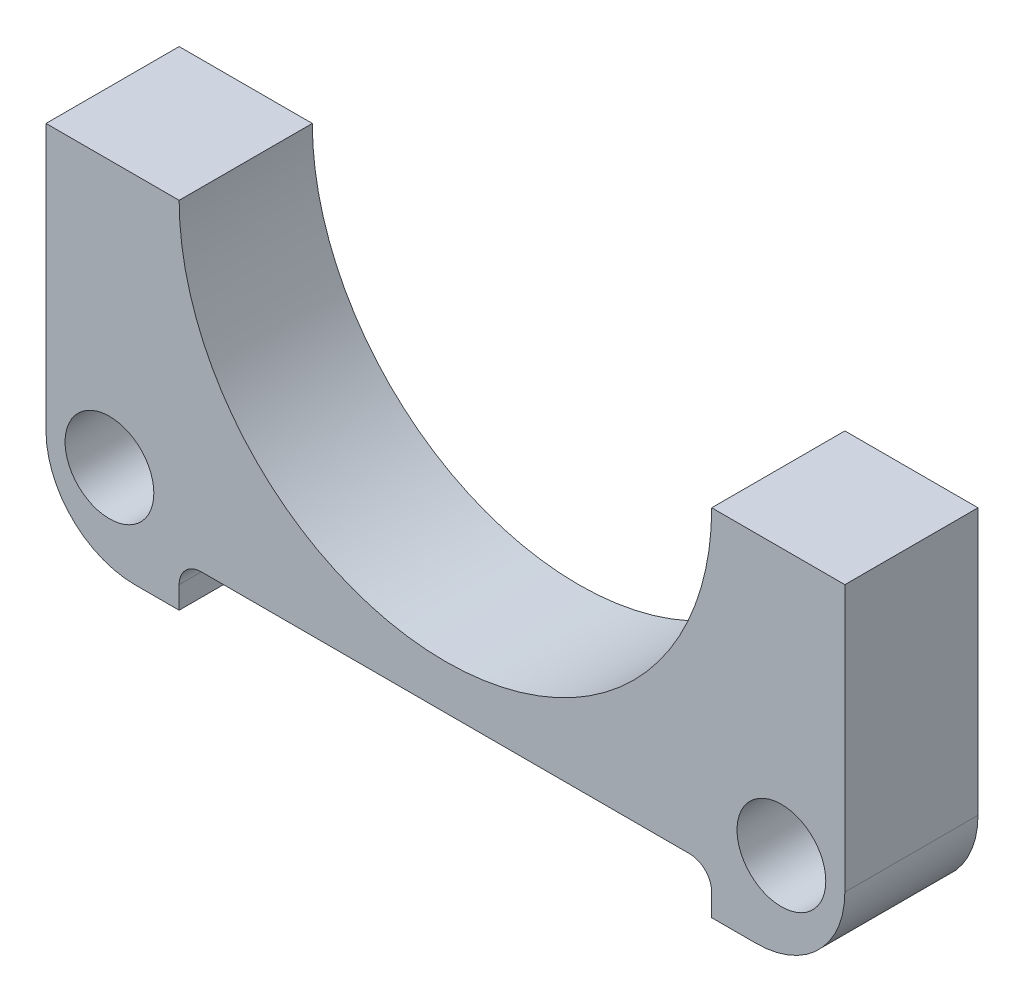
ISO-10303-21;
HEADER;
FILE_DESCRIPTION(('STEP AP214'),'2;1');
FILE_NAME('part.step','',(''),(''),'','','');
FILE_SCHEMA(('AUTOMOTIVE_DESIGN { 1 0 10303 214 1 1 1 1 }'));
ENDSEC;
DATA;
#1=APPLICATION_CONTEXT('core data for automotive mechanical design processes');
#2=APPLICATION_PROTOCOL_DEFINITION('international standard','automotive_design',2000,#1);
#3=PRODUCT_CONTEXT('',#1,'mechanical');
#4=PRODUCT('Part','Part','',(#3));
#5=PRODUCT_RELATED_PRODUCT_CATEGORY('part','',(#4));
#6=PRODUCT_DEFINITION_FORMATION('','',#4);
#7=PRODUCT_DEFINITION_CONTEXT('part definition',#1,'design');
#8=PRODUCT_DEFINITION('design','',#6,#7);
#9=PRODUCT_DEFINITION_SHAPE('','',#8);
#10=(LENGTH_UNIT() NAMED_UNIT(*) SI_UNIT(.MILLI.,.METRE.));
#11=(NAMED_UNIT(*) PLANE_ANGLE_UNIT() SI_UNIT($,.RADIAN.));
#12=(NAMED_UNIT(*) SI_UNIT($,.STERADIAN.) SOLID_ANGLE_UNIT());
#13=UNCERTAINTY_MEASURE_WITH_UNIT(LENGTH_MEASURE(1.E-05),#10,'distance_accuracy_value','');
#14=(GEOMETRIC_REPRESENTATION_CONTEXT(3) GLOBAL_UNCERTAINTY_ASSIGNED_CONTEXT((#13)) GLOBAL_UNIT_ASSIGNED_CONTEXT((#10,
#11,#12)) REPRESENTATION_CONTEXT('',''));
#15=CARTESIAN_POINT('',(0.,0.,0.));
#16=DIRECTION('',(0.,0.,1.));
#17=DIRECTION('',(1.,0.,0.));
#18=AXIS2_PLACEMENT_3D('',#15,#16,#17);
#19=CARTESIAN_POINT('',(-70.,-20.,15.));
#20=DIRECTION('',(0.,0.,1.));
#21=DIRECTION('',(1.,0.,0.));
#22=AXIS2_PLACEMENT_3D('',#19,#20,#21);
#23=PLANE('',#22);
#24=CARTESIAN_POINT('',(-75.7021101109994,-20.,15.));
#25=DIRECTION('',(0.,0.,1.));
#26=DIRECTION('',(1.,0.,0.));
#27=AXIS2_PLACEMENT_3D('',#24,#25,#26);
#28=CIRCLE('',#27,9.99999999999999);
#29=CARTESIAN_POINT('',(-65.7021101109994,-20.,15.));
#30=VERTEX_POINT('',#29);
#31=EDGE_CURVE('E188',#30,#30,#28,.T.);
#32=ORIENTED_EDGE('',*,*,#31,.F.);
#33=EDGE_LOOP('',(#32));
#34=FACE_BOUND('',#33,.T.);
#35=DIRECTION('',(0.,-1.,0.));
#36=VECTOR('',#35,1.);
#37=CARTESIAN_POINT('',(-90.,40.,15.));
#38=LINE('',#37,#36);
#39=CARTESIAN_POINT('',(-90.,40.,15.));
#40=VERTEX_POINT('',#39);
#41=CARTESIAN_POINT('',(-90.,-19.9999999999998,15.));
#42=VERTEX_POINT('',#41);
#43=EDGE_CURVE('E224',#40,#42,#38,.T.);
#44=ORIENTED_EDGE('',*,*,#43,.T.);
#45=CARTESIAN_POINT('',(-70.,-20.,15.));
#46=DIRECTION('',(0.,0.,1.));
#47=DIRECTION('',(1.,0.,0.));
#48=AXIS2_PLACEMENT_3D('',#45,#46,#47);
#49=CIRCLE('',#48,20.);
#50=CARTESIAN_POINT('',(-69.9999999999999,-40.,15.));
#51=VERTEX_POINT('',#50);
#52=EDGE_CURVE('E124',#42,#51,#49,.T.);
#53=ORIENTED_EDGE('',*,*,#52,.T.);
#54=DIRECTION('',(1.,0.,0.));
#55=VECTOR('',#54,1.);
#56=CARTESIAN_POINT('',(-69.9999999999999,-40.,15.));
#57=LINE('',#56,#55);
#58=CARTESIAN_POINT('',(-60.,-40.,15.));
#59=VERTEX_POINT('',#58);
#60=EDGE_CURVE('E269',#51,#59,#57,.T.);
#61=ORIENTED_EDGE('',*,*,#60,.T.);
#62=DIRECTION('',(0.,1.,0.));
#63=VECTOR('',#62,1.);
#64=CARTESIAN_POINT('',(-60.,-35.,15.));
#65=LINE('',#64,#63);
#66=CARTESIAN_POINT('',(-60.,-35.,15.));
#67=VERTEX_POINT('',#66);
#68=EDGE_CURVE('E289',#59,#67,#65,.T.);
#69=ORIENTED_EDGE('',*,*,#68,.T.);
#70=CARTESIAN_POINT('',(-55.,-35.,15.));
#71=DIRECTION('',(0.,0.,-1.));
#72=DIRECTION('',(1.,0.,0.));
#73=AXIS2_PLACEMENT_3D('',#70,#71,#72);
#74=CIRCLE('',#73,5.);
#75=CARTESIAN_POINT('',(-55.,-30.,15.));
#76=VERTEX_POINT('',#75);
#77=EDGE_CURVE('E285',#67,#76,#74,.T.);
#78=ORIENTED_EDGE('',*,*,#77,.T.);
#79=DIRECTION('',(1.,0.,0.));
#80=VECTOR('',#79,1.);
#81=CARTESIAN_POINT('',(-55.,-30.,15.));
#82=LINE('',#81,#80);
#83=CARTESIAN_POINT('',(55.,-30.,15.));
#84=VERTEX_POINT('',#83);
#85=EDGE_CURVE('E288',#76,#84,#82,.T.);
#86=ORIENTED_EDGE('',*,*,#85,.T.);
#87=CARTESIAN_POINT('',(55.,-35.,15.));
#88=DIRECTION('',(0.,0.,-1.));
#89=DIRECTION('',(-1.,0.,0.));
#90=AXIS2_PLACEMENT_3D('',#87,#88,#89);
#91=CIRCLE('',#90,5.);
#92=CARTESIAN_POINT('',(60.,-35.,15.));
#93=VERTEX_POINT('',#92);
#94=EDGE_CURVE('E293',#84,#93,#91,.T.);
#95=ORIENTED_EDGE('',*,*,#94,.T.);
#96=DIRECTION('',(0.,-1.,0.));
#97=VECTOR('',#96,1.);
#98=CARTESIAN_POINT('',(60.,-35.,15.));
#99=LINE('',#98,#97);
#100=CARTESIAN_POINT('',(60.,-40.,15.));
#101=VERTEX_POINT('',#100);
#102=EDGE_CURVE('E300',#93,#101,#99,.T.);
#103=ORIENTED_EDGE('',*,*,#102,.T.);
#104=DIRECTION('',(1.,0.,0.));
#105=VECTOR('',#104,1.);
#106=CARTESIAN_POINT('',(60.,-40.,15.));
#107=LINE('',#106,#105);
#108=CARTESIAN_POINT('',(69.9999999999998,-40.,15.));
#109=VERTEX_POINT('',#108);
#110=EDGE_CURVE('E303',#101,#109,#107,.T.);
#111=ORIENTED_EDGE('',*,*,#110,.T.);
#112=CARTESIAN_POINT('',(70.,-20.,15.));
#113=DIRECTION('',(0.,0.,1.));
#114=DIRECTION('',(1.,0.,0.));
#115=AXIS2_PLACEMENT_3D('',#112,#113,#114);
#116=CIRCLE('',#115,20.);
#117=CARTESIAN_POINT('',(90.,-19.9999999999999,15.));
#118=VERTEX_POINT('',#117);
#119=EDGE_CURVE('E306',#109,#118,#116,.T.);
#120=ORIENTED_EDGE('',*,*,#119,.T.);
#121=DIRECTION('',(0.,1.,0.));
#122=VECTOR('',#121,1.);
#123=CARTESIAN_POINT('',(90.,40.,15.));
#124=LINE('',#123,#122);
#125=CARTESIAN_POINT('',(90.,40.,15.));
#126=VERTEX_POINT('',#125);
#127=EDGE_CURVE('E161',#118,#126,#124,.T.);
#128=ORIENTED_EDGE('',*,*,#127,.T.);
#129=DIRECTION('',(-1.,0.,0.));
#130=VECTOR('',#129,1.);
#131=CARTESIAN_POINT('',(60.,40.,15.));
#132=LINE('',#131,#130);
#133=CARTESIAN_POINT('',(60.,40.,15.));
#134=VERTEX_POINT('',#133);
#135=EDGE_CURVE('E155',#126,#134,#132,.T.);
#136=ORIENTED_EDGE('',*,*,#135,.T.);
#137=CARTESIAN_POINT('',(0.,40.,15.));
#138=DIRECTION('',(0.,0.,-1.));
#139=DIRECTION('',(1.,0.,0.));
#140=AXIS2_PLACEMENT_3D('',#137,#138,#139);
#141=CIRCLE('',#140,60.);
#142=CARTESIAN_POINT('',(-60.,40.,15.));
#143=VERTEX_POINT('',#142);
#144=EDGE_CURVE('E159',#134,#143,#141,.T.);
#145=ORIENTED_EDGE('',*,*,#144,.T.);
#146=DIRECTION('',(-1.,0.,0.));
#147=VECTOR('',#146,1.);
#148=CARTESIAN_POINT('',(-90.,40.,15.));
#149=LINE('',#148,#147);
#150=EDGE_CURVE('E63',#143,#40,#149,.T.);
#151=ORIENTED_EDGE('',*,*,#150,.T.);
#152=EDGE_LOOP('',(#44,#53,#61,#69,#78,#86,#95,#103,#111,#120,#128,#136,#145,#151));
#153=FACE_BOUND('',#152,.T.);
#154=CARTESIAN_POINT('',(75.7,-20.,15.));
#155=DIRECTION('',(0.,0.,1.));
#156=DIRECTION('',(1.,0.,0.));
#157=AXIS2_PLACEMENT_3D('',#154,#155,#156);
#158=CIRCLE('',#157,9.99999999999999);
#159=CARTESIAN_POINT('',(85.7,-20.,15.));
#160=VERTEX_POINT('',#159);
#161=EDGE_CURVE('E350',#160,#160,#158,.T.);
#162=ORIENTED_EDGE('',*,*,#161,.F.);
#163=EDGE_LOOP('',(#162));
#164=FACE_BOUND('',#163,.T.);
#165=ADVANCED_FACE('F45',(#34,#153,#164),#23,.T.);
#166=CARTESIAN_POINT('',(-70.,-20.,-15.));
#167=DIRECTION('',(0.,0.,1.));
#168=DIRECTION('',(1.,0.,0.));
#169=AXIS2_PLACEMENT_3D('',#166,#167,#168);
#170=PLANE('',#169);
#171=DIRECTION('',(0.,-1.,0.));
#172=VECTOR('',#171,1.);
#173=CARTESIAN_POINT('',(-90.,40.,-15.));
#174=LINE('',#173,#172);
#175=CARTESIAN_POINT('',(-90.,40.,-15.));
#176=VERTEX_POINT('',#175);
#177=CARTESIAN_POINT('',(-90.,-19.9999999999998,-15.));
#178=VERTEX_POINT('',#177);
#179=EDGE_CURVE('E183',#176,#178,#174,.T.);
#180=ORIENTED_EDGE('',*,*,#179,.F.);
#181=DIRECTION('',(-1.,0.,0.));
#182=VECTOR('',#181,1.);
#183=CARTESIAN_POINT('',(-90.,40.,-15.));
#184=LINE('',#183,#182);
#185=CARTESIAN_POINT('',(-60.,40.,-15.));
#186=VERTEX_POINT('',#185);
#187=EDGE_CURVE('E116',#186,#176,#184,.T.);
#188=ORIENTED_EDGE('',*,*,#187,.F.);
#189=CARTESIAN_POINT('',(0.,40.,-15.));
#190=DIRECTION('',(0.,0.,-1.));
#191=DIRECTION('',(1.,0.,0.));
#192=AXIS2_PLACEMENT_3D('',#189,#190,#191);
#193=CIRCLE('',#192,60.);
#194=CARTESIAN_POINT('',(60.,40.,-15.));
#195=VERTEX_POINT('',#194);
#196=EDGE_CURVE('E110',#195,#186,#193,.T.);
#197=ORIENTED_EDGE('',*,*,#196,.F.);
#198=DIRECTION('',(-1.,0.,0.));
#199=VECTOR('',#198,1.);
#200=CARTESIAN_POINT('',(60.,40.,-15.));
#201=LINE('',#200,#199);
#202=CARTESIAN_POINT('',(90.,40.,-15.));
#203=VERTEX_POINT('',#202);
#204=EDGE_CURVE('E170',#203,#195,#201,.T.);
#205=ORIENTED_EDGE('',*,*,#204,.F.);
#206=DIRECTION('',(0.,1.,0.));
#207=VECTOR('',#206,1.);
#208=CARTESIAN_POINT('',(90.,40.,-15.));
#209=LINE('',#208,#207);
#210=CARTESIAN_POINT('',(90.,-19.9999999999999,-15.));
#211=VERTEX_POINT('',#210);
#212=EDGE_CURVE('E215',#211,#203,#209,.T.);
#213=ORIENTED_EDGE('',*,*,#212,.F.);
#214=CARTESIAN_POINT('',(70.,-20.,-15.));
#215=DIRECTION('',(0.,0.,1.));
#216=DIRECTION('',(1.,0.,0.));
#217=AXIS2_PLACEMENT_3D('',#214,#215,#216);
#218=CIRCLE('',#217,20.);
#219=CARTESIAN_POINT('',(69.9999999999998,-40.,-15.));
#220=VERTEX_POINT('',#219);
#221=EDGE_CURVE('E212',#220,#211,#218,.T.);
#222=ORIENTED_EDGE('',*,*,#221,.F.);
#223=DIRECTION('',(1.,0.,0.));
#224=VECTOR('',#223,1.);
#225=CARTESIAN_POINT('',(60.,-40.,-15.));
#226=LINE('',#225,#224);
#227=CARTESIAN_POINT('',(60.,-40.,-15.));
#228=VERTEX_POINT('',#227);
#229=EDGE_CURVE('E209',#228,#220,#226,.T.);
#230=ORIENTED_EDGE('',*,*,#229,.F.);
#231=DIRECTION('',(0.,-1.,0.));
#232=VECTOR('',#231,1.);
#233=CARTESIAN_POINT('',(60.,-35.,-15.));
#234=LINE('',#233,#232);
#235=CARTESIAN_POINT('',(60.,-35.,-15.));
#236=VERTEX_POINT('',#235);
#237=EDGE_CURVE('E206',#236,#228,#234,.T.);
#238=ORIENTED_EDGE('',*,*,#237,.F.);
#239=CARTESIAN_POINT('',(55.,-35.,-15.));
#240=DIRECTION('',(0.,0.,-1.));
#241=DIRECTION('',(-1.,0.,0.));
#242=AXIS2_PLACEMENT_3D('',#239,#240,#241);
#243=CIRCLE('',#242,5.);
#244=CARTESIAN_POINT('',(55.,-30.,-15.));
#245=VERTEX_POINT('',#244);
#246=EDGE_CURVE('E203',#245,#236,#243,.T.);
#247=ORIENTED_EDGE('',*,*,#246,.F.);
#248=DIRECTION('',(1.,0.,0.));
#249=VECTOR('',#248,1.);
#250=CARTESIAN_POINT('',(-55.,-30.,-15.));
#251=LINE('',#250,#249);
#252=CARTESIAN_POINT('',(-55.,-30.,-15.));
#253=VERTEX_POINT('',#252);
#254=EDGE_CURVE('E200',#253,#245,#251,.T.);
#255=ORIENTED_EDGE('',*,*,#254,.F.);
#256=CARTESIAN_POINT('',(-55.,-35.,-15.));
#257=DIRECTION('',(0.,0.,-1.));
#258=DIRECTION('',(1.,0.,0.));
#259=AXIS2_PLACEMENT_3D('',#256,#257,#258);
#260=CIRCLE('',#259,5.);
#261=CARTESIAN_POINT('',(-60.,-35.,-15.));
#262=VERTEX_POINT('',#261);
#263=EDGE_CURVE('E197',#262,#253,#260,.T.);
#264=ORIENTED_EDGE('',*,*,#263,.F.);
#265=DIRECTION('',(0.,1.,0.));
#266=VECTOR('',#265,1.);
#267=CARTESIAN_POINT('',(-60.,-35.,-15.));
#268=LINE('',#267,#266);
#269=CARTESIAN_POINT('',(-60.,-40.,-15.));
#270=VERTEX_POINT('',#269);
#271=EDGE_CURVE('E194',#270,#262,#268,.T.);
#272=ORIENTED_EDGE('',*,*,#271,.F.);
#273=DIRECTION('',(1.,0.,0.));
#274=VECTOR('',#273,1.);
#275=CARTESIAN_POINT('',(-69.9999999999999,-40.,-15.));
#276=LINE('',#275,#274);
#277=CARTESIAN_POINT('',(-69.9999999999999,-40.,-15.));
#278=VERTEX_POINT('',#277);
#279=EDGE_CURVE('E191',#278,#270,#276,.T.);
#280=ORIENTED_EDGE('',*,*,#279,.F.);
#281=CARTESIAN_POINT('',(-70.,-20.,-15.));
#282=DIRECTION('',(0.,0.,1.));
#283=DIRECTION('',(1.,0.,0.));
#284=AXIS2_PLACEMENT_3D('',#281,#282,#283);
#285=CIRCLE('',#284,20.);
#286=EDGE_CURVE('E187',#178,#278,#285,.T.);
#287=ORIENTED_EDGE('',*,*,#286,.F.);
#288=EDGE_LOOP('',(#180,#188,#197,#205,#213,#222,#230,#238,#247,#255,#264,#272,#280,#287));
#289=FACE_BOUND('',#288,.T.);
#290=CARTESIAN_POINT('',(-75.7021101109994,-20.,-15.));
#291=DIRECTION('',(0.,0.,1.));
#292=DIRECTION('',(1.,0.,0.));
#293=AXIS2_PLACEMENT_3D('',#290,#291,#292);
#294=CIRCLE('',#293,9.99999999999999);
#295=CARTESIAN_POINT('',(-65.7021101109994,-20.,-15.));
#296=VERTEX_POINT('',#295);
#297=EDGE_CURVE('E358',#296,#296,#294,.T.);
#298=ORIENTED_EDGE('',*,*,#297,.T.);
#299=EDGE_LOOP('',(#298));
#300=FACE_BOUND('',#299,.T.);
#301=CARTESIAN_POINT('',(75.7,-20.,-15.));
#302=DIRECTION('',(0.,0.,1.));
#303=DIRECTION('',(1.,0.,0.));
#304=AXIS2_PLACEMENT_3D('',#301,#302,#303);
#305=CIRCLE('',#304,9.99999999999999);
#306=CARTESIAN_POINT('',(85.7,-20.,-15.));
#307=VERTEX_POINT('',#306);
#308=EDGE_CURVE('E353',#307,#307,#305,.T.);
#309=ORIENTED_EDGE('',*,*,#308,.T.);
#310=EDGE_LOOP('',(#309));
#311=FACE_BOUND('',#310,.T.);
#312=ADVANCED_FACE('F273',(#289,#300,#311),#170,.F.);
#313=CARTESIAN_POINT('',(-90.,40.,15.));
#314=DIRECTION('',(1.,0.,0.));
#315=DIRECTION('',(0.,1.,0.));
#316=AXIS2_PLACEMENT_3D('',#313,#314,#315);
#317=PLANE('',#316);
#318=ORIENTED_EDGE('',*,*,#179,.T.);
#319=DIRECTION('',(0.,0.,-1.));
#320=VECTOR('',#319,1.);
#321=CARTESIAN_POINT('',(-90.,-19.9999999999998,15.));
#322=LINE('',#321,#320);
#323=EDGE_CURVE('E11',#42,#178,#322,.T.);
#324=ORIENTED_EDGE('',*,*,#323,.F.);
#325=ORIENTED_EDGE('',*,*,#43,.F.);
#326=DIRECTION('',(0.,0.,-1.));
#327=VECTOR('',#326,1.);
#328=CARTESIAN_POINT('',(-90.,40.,15.));
#329=LINE('',#328,#327);
#330=EDGE_CURVE('E179',#40,#176,#329,.T.);
#331=ORIENTED_EDGE('',*,*,#330,.T.);
#332=EDGE_LOOP('',(#318,#324,#325,#331));
#333=FACE_BOUND('',#332,.T.);
#334=ADVANCED_FACE('F47',(#333),#317,.F.);
#335=CARTESIAN_POINT('',(-70.,-20.,15.));
#336=DIRECTION('',(0.,0.,-1.));
#337=DIRECTION('',(-1.,0.,0.));
#338=AXIS2_PLACEMENT_3D('',#335,#336,#337);
#339=CYLINDRICAL_SURFACE('',#338,20.);
#340=ORIENTED_EDGE('',*,*,#286,.T.);
#341=DIRECTION('',(0.,0.,-1.));
#342=VECTOR('',#341,1.);
#343=CARTESIAN_POINT('',(-69.9999999999999,-40.,15.));
#344=LINE('',#343,#342);
#345=EDGE_CURVE('E55',#51,#278,#344,.T.);
#346=ORIENTED_EDGE('',*,*,#345,.F.);
#347=ORIENTED_EDGE('',*,*,#52,.F.);
#348=ORIENTED_EDGE('',*,*,#323,.T.);
#349=EDGE_LOOP('',(#340,#346,#347,#348));
#350=FACE_BOUND('',#349,.T.);
#351=ADVANCED_FACE('F478',(#350),#339,.T.);
#352=CARTESIAN_POINT('',(-69.9999999999999,-40.,15.));
#353=DIRECTION('',(0.,1.,0.));
#354=DIRECTION('',(0.,0.,1.));
#355=AXIS2_PLACEMENT_3D('',#352,#353,#354);
#356=PLANE('',#355);
#357=ORIENTED_EDGE('',*,*,#279,.T.);
#358=DIRECTION('',(0.,0.,-1.));
#359=VECTOR('',#358,1.);
#360=CARTESIAN_POINT('',(-60.,-40.,15.));
#361=LINE('',#360,#359);
#362=EDGE_CURVE('E259',#59,#270,#361,.T.);
#363=ORIENTED_EDGE('',*,*,#362,.F.);
#364=ORIENTED_EDGE('',*,*,#60,.F.);
#365=ORIENTED_EDGE('',*,*,#345,.T.);
#366=EDGE_LOOP('',(#357,#363,#364,#365));
#367=FACE_BOUND('',#366,.T.);
#368=ADVANCED_FACE('F267',(#367),#356,.F.);
#369=CARTESIAN_POINT('',(-60.,-35.,15.));
#370=DIRECTION('',(-1.,0.,0.));
#371=DIRECTION('',(0.,0.,1.));
#372=AXIS2_PLACEMENT_3D('',#369,#370,#371);
#373=PLANE('',#372);
#374=ORIENTED_EDGE('',*,*,#271,.T.);
#375=DIRECTION('',(0.,0.,-1.));
#376=VECTOR('',#375,1.);
#377=CARTESIAN_POINT('',(-60.,-35.,15.));
#378=LINE('',#377,#376);
#379=EDGE_CURVE('E255',#67,#262,#378,.T.);
#380=ORIENTED_EDGE('',*,*,#379,.F.);
#381=ORIENTED_EDGE('',*,*,#68,.F.);
#382=ORIENTED_EDGE('',*,*,#362,.T.);
#383=EDGE_LOOP('',(#374,#380,#381,#382));
#384=FACE_BOUND('',#383,.T.);
#385=ADVANCED_FACE('F279',(#384),#373,.F.);
#386=CARTESIAN_POINT('',(-55.,-35.,15.));
#387=DIRECTION('',(0.,0.,-1.));
#388=DIRECTION('',(-1.,0.,0.));
#389=AXIS2_PLACEMENT_3D('',#386,#387,#388);
#390=CYLINDRICAL_SURFACE('',#389,5.);
#391=ORIENTED_EDGE('',*,*,#263,.T.);
#392=DIRECTION('',(0.,0.,-1.));
#393=VECTOR('',#392,1.);
#394=CARTESIAN_POINT('',(-55.,-30.,15.));
#395=LINE('',#394,#393);
#396=EDGE_CURVE('E251',#76,#253,#395,.T.);
#397=ORIENTED_EDGE('',*,*,#396,.F.);
#398=ORIENTED_EDGE('',*,*,#77,.F.);
#399=ORIENTED_EDGE('',*,*,#379,.T.);
#400=EDGE_LOOP('',(#391,#397,#398,#399));
#401=FACE_BOUND('',#400,.T.);
#402=ADVANCED_FACE('F283',(#401),#390,.F.);
#403=CARTESIAN_POINT('',(-55.,-30.,15.));
#404=DIRECTION('',(0.,1.,0.));
#405=DIRECTION('',(-1.,0.,0.));
#406=AXIS2_PLACEMENT_3D('',#403,#404,#405);
#407=PLANE('',#406);
#408=ORIENTED_EDGE('',*,*,#254,.T.);
#409=DIRECTION('',(0.,0.,-1.));
#410=VECTOR('',#409,1.);
#411=CARTESIAN_POINT('',(55.,-30.,15.));
#412=LINE('',#411,#410);
#413=EDGE_CURVE('E247',#84,#245,#412,.T.);
#414=ORIENTED_EDGE('',*,*,#413,.F.);
#415=ORIENTED_EDGE('',*,*,#85,.F.);
#416=ORIENTED_EDGE('',*,*,#396,.T.);
#417=EDGE_LOOP('',(#408,#414,#415,#416));
#418=FACE_BOUND('',#417,.T.);
#419=ADVANCED_FACE('F443',(#418),#407,.F.);
#420=CARTESIAN_POINT('',(55.,-35.,15.));
#421=DIRECTION('',(0.,0.,-1.));
#422=DIRECTION('',(-1.,0.,0.));
#423=AXIS2_PLACEMENT_3D('',#420,#421,#422);
#424=CYLINDRICAL_SURFACE('',#423,5.);
#425=ORIENTED_EDGE('',*,*,#246,.T.);
#426=DIRECTION('',(0.,0.,-1.));
#427=VECTOR('',#426,1.);
#428=CARTESIAN_POINT('',(60.,-35.,15.));
#429=LINE('',#428,#427);
#430=EDGE_CURVE('E243',#93,#236,#429,.T.);
#431=ORIENTED_EDGE('',*,*,#430,.F.);
#432=ORIENTED_EDGE('',*,*,#94,.F.);
#433=ORIENTED_EDGE('',*,*,#413,.T.);
#434=EDGE_LOOP('',(#425,#431,#432,#433));
#435=FACE_BOUND('',#434,.T.);
#436=ADVANCED_FACE('F433',(#435),#424,.F.);
#437=CARTESIAN_POINT('',(60.,-35.,15.));
#438=DIRECTION('',(1.,0.,0.));
#439=DIRECTION('',(0.,0.,-1.));
#440=AXIS2_PLACEMENT_3D('',#437,#438,#439);
#441=PLANE('',#440);
#442=ORIENTED_EDGE('',*,*,#237,.T.);
#443=DIRECTION('',(0.,0.,-1.));
#444=VECTOR('',#443,1.);
#445=CARTESIAN_POINT('',(60.,-40.,15.));
#446=LINE('',#445,#444);
#447=EDGE_CURVE('E239',#101,#228,#446,.T.);
#448=ORIENTED_EDGE('',*,*,#447,.F.);
#449=ORIENTED_EDGE('',*,*,#102,.F.);
#450=ORIENTED_EDGE('',*,*,#430,.T.);
#451=EDGE_LOOP('',(#442,#448,#449,#450));
#452=FACE_BOUND('',#451,.T.);
#453=ADVANCED_FACE('F423',(#452),#441,.F.);
#454=CARTESIAN_POINT('',(60.,-40.,15.));
#455=DIRECTION('',(0.,1.,0.));
#456=DIRECTION('',(0.,0.,1.));
#457=AXIS2_PLACEMENT_3D('',#454,#455,#456);
#458=PLANE('',#457);
#459=ORIENTED_EDGE('',*,*,#229,.T.);
#460=DIRECTION('',(0.,0.,-1.));
#461=VECTOR('',#460,1.);
#462=CARTESIAN_POINT('',(69.9999999999998,-40.,15.));
#463=LINE('',#462,#461);
#464=EDGE_CURVE('E235',#109,#220,#463,.T.);
#465=ORIENTED_EDGE('',*,*,#464,.F.);
#466=ORIENTED_EDGE('',*,*,#110,.F.);
#467=ORIENTED_EDGE('',*,*,#447,.T.);
#468=EDGE_LOOP('',(#459,#465,#466,#467));
#469=FACE_BOUND('',#468,.T.);
#470=ADVANCED_FACE('F414',(#469),#458,.F.);
#471=CARTESIAN_POINT('',(70.,-20.,15.));
#472=DIRECTION('',(0.,0.,-1.));
#473=DIRECTION('',(-1.,0.,0.));
#474=AXIS2_PLACEMENT_3D('',#471,#472,#473);
#475=CYLINDRICAL_SURFACE('',#474,20.);
#476=ORIENTED_EDGE('',*,*,#221,.T.);
#477=DIRECTION('',(0.,0.,-1.));
#478=VECTOR('',#477,1.);
#479=CARTESIAN_POINT('',(90.,-19.9999999999999,15.));
#480=LINE('',#479,#478);
#481=EDGE_CURVE('E231',#118,#211,#480,.T.);
#482=ORIENTED_EDGE('',*,*,#481,.F.);
#483=ORIENTED_EDGE('',*,*,#119,.F.);
#484=ORIENTED_EDGE('',*,*,#464,.T.);
#485=EDGE_LOOP('',(#476,#482,#483,#484));
#486=FACE_BOUND('',#485,.T.);
#487=ADVANCED_FACE('F314',(#486),#475,.T.);
#488=CARTESIAN_POINT('',(90.,40.,15.));
#489=DIRECTION('',(-1.,0.,0.));
#490=DIRECTION('',(0.,-1.,0.));
#491=AXIS2_PLACEMENT_3D('',#488,#489,#490);
#492=PLANE('',#491);
#493=ORIENTED_EDGE('',*,*,#212,.T.);
#494=DIRECTION('',(0.,0.,-1.));
#495=VECTOR('',#494,1.);
#496=CARTESIAN_POINT('',(90.,40.,15.));
#497=LINE('',#496,#495);
#498=EDGE_CURVE('E172',#126,#203,#497,.T.);
#499=ORIENTED_EDGE('',*,*,#498,.F.);
#500=ORIENTED_EDGE('',*,*,#127,.F.);
#501=ORIENTED_EDGE('',*,*,#481,.T.);
#502=EDGE_LOOP('',(#493,#499,#500,#501));
#503=FACE_BOUND('',#502,.T.);
#504=ADVANCED_FACE('F318',(#503),#492,.F.);
#505=CARTESIAN_POINT('',(60.,40.,15.));
#506=DIRECTION('',(0.,-1.,0.));
#507=DIRECTION('',(0.,0.,-1.));
#508=AXIS2_PLACEMENT_3D('',#505,#506,#507);
#509=PLANE('',#508);
#510=ORIENTED_EDGE('',*,*,#204,.T.);
#511=DIRECTION('',(0.,0.,-1.));
#512=VECTOR('',#511,1.);
#513=CARTESIAN_POINT('',(60.,40.,15.));
#514=LINE('',#513,#512);
#515=EDGE_CURVE('E167',#134,#195,#514,.T.);
#516=ORIENTED_EDGE('',*,*,#515,.F.);
#517=ORIENTED_EDGE('',*,*,#135,.F.);
#518=ORIENTED_EDGE('',*,*,#498,.T.);
#519=EDGE_LOOP('',(#510,#516,#517,#518));
#520=FACE_BOUND('',#519,.T.);
#521=ADVANCED_FACE('F168',(#520),#509,.F.);
#522=CARTESIAN_POINT('',(0.,40.,15.));
#523=DIRECTION('',(0.,0.,-1.));
#524=DIRECTION('',(-1.,0.,0.));
#525=AXIS2_PLACEMENT_3D('',#522,#523,#524);
#526=CYLINDRICAL_SURFACE('',#525,60.);
#527=ORIENTED_EDGE('',*,*,#196,.T.);
#528=DIRECTION('',(0.,0.,-1.));
#529=VECTOR('',#528,1.);
#530=CARTESIAN_POINT('',(-60.,40.,15.));
#531=LINE('',#530,#529);
#532=EDGE_CURVE('E173',#143,#186,#531,.T.);
#533=ORIENTED_EDGE('',*,*,#532,.F.);
#534=ORIENTED_EDGE('',*,*,#144,.F.);
#535=ORIENTED_EDGE('',*,*,#515,.T.);
#536=EDGE_LOOP('',(#527,#533,#534,#535));
#537=FACE_BOUND('',#536,.T.);
#538=ADVANCED_FACE('F175',(#537),#526,.F.);
#539=CARTESIAN_POINT('',(-90.,40.,15.));
#540=DIRECTION('',(0.,-1.,0.));
#541=DIRECTION('',(0.,0.,-1.));
#542=AXIS2_PLACEMENT_3D('',#539,#540,#541);
#543=PLANE('',#542);
#544=ORIENTED_EDGE('',*,*,#187,.T.);
#545=ORIENTED_EDGE('',*,*,#330,.F.);
#546=ORIENTED_EDGE('',*,*,#150,.F.);
#547=ORIENTED_EDGE('',*,*,#532,.T.);
#548=EDGE_LOOP('',(#544,#545,#546,#547));
#549=FACE_BOUND('',#548,.T.);
#550=ADVANCED_FACE('F322',(#549),#543,.F.);
#551=CARTESIAN_POINT('',(-75.7021101109994,-20.,15.));
#552=DIRECTION('',(0.,0.,-1.));
#553=DIRECTION('',(-1.,0.,0.));
#554=AXIS2_PLACEMENT_3D('',#551,#552,#553);
#555=CYLINDRICAL_SURFACE('',#554,9.99999999999999);
#556=ORIENTED_EDGE('',*,*,#31,.T.);
#557=EDGE_LOOP('',(#556));
#558=FACE_BOUND('',#557,.T.);
#559=ORIENTED_EDGE('',*,*,#297,.F.);
#560=EDGE_LOOP('',(#559));
#561=FACE_BOUND('',#560,.T.);
#562=ADVANCED_FACE('F324',(#558,#561),#555,.F.);
#563=CARTESIAN_POINT('',(75.7,-20.,15.));
#564=DIRECTION('',(0.,0.,-1.));
#565=DIRECTION('',(-1.,0.,0.));
#566=AXIS2_PLACEMENT_3D('',#563,#564,#565);
#567=CYLINDRICAL_SURFACE('',#566,9.99999999999999);
#568=ORIENTED_EDGE('',*,*,#161,.T.);
#569=EDGE_LOOP('',(#568));
#570=FACE_BOUND('',#569,.T.);
#571=ORIENTED_EDGE('',*,*,#308,.F.);
#572=EDGE_LOOP('',(#571));
#573=FACE_BOUND('',#572,.T.);
#574=ADVANCED_FACE('F330',(#570,#573),#567,.F.);
#575=CLOSED_SHELL('',(#165,#312,#334,#351,#368,#385,#402,#419,#436,#453,#470,#487,#504,#521,
#538,#550,#562,#574));
#576=MANIFOLD_SOLID_BREP('B2',#575);
#577=ADVANCED_BREP_SHAPE_REPRESENTATION('',(#18,#576),#14);
#578=SHAPE_DEFINITION_REPRESENTATION(#9,#577);
ENDSEC;
END-ISO-10303-21;
